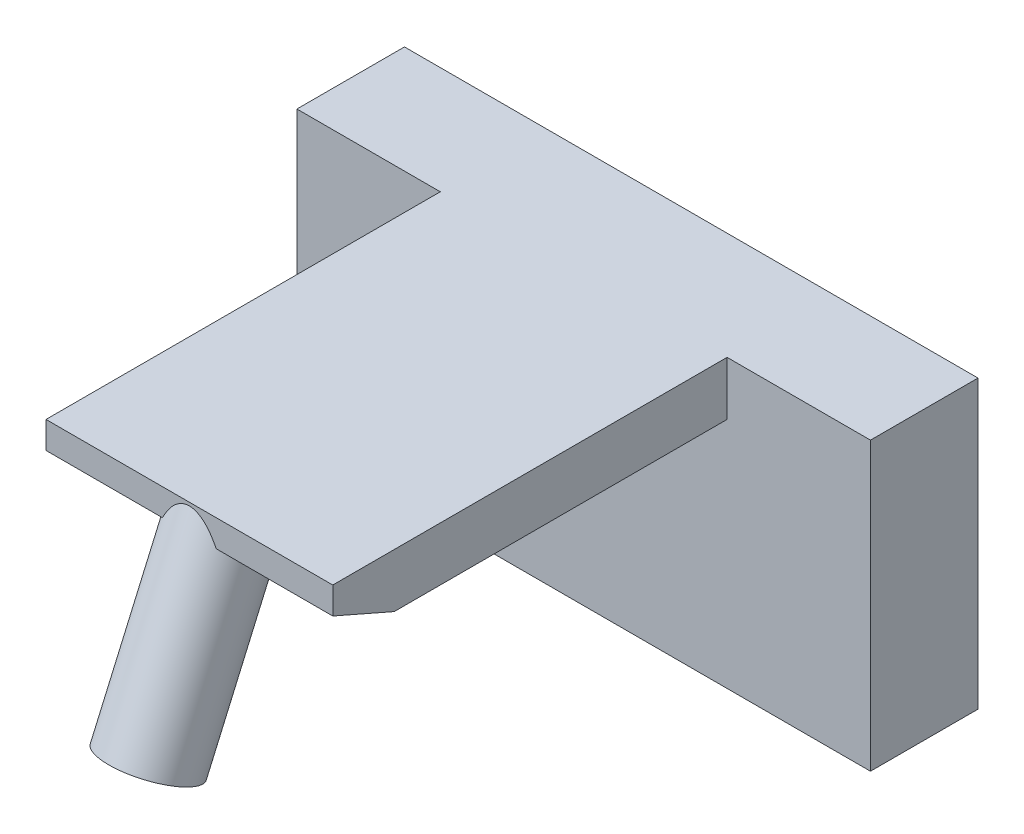
ISO-10303-21;
HEADER;
FILE_DESCRIPTION(('STEP AP214'),'2;1');
FILE_NAME('part.step','',(''),(''),'','','');
FILE_SCHEMA(('AUTOMOTIVE_DESIGN { 1 0 10303 214 1 1 1 1 }'));
ENDSEC;
DATA;
#1=APPLICATION_CONTEXT('core data for automotive mechanical design processes');
#2=APPLICATION_PROTOCOL_DEFINITION('international standard','automotive_design',2000,#1);
#3=PRODUCT_CONTEXT('',#1,'mechanical');
#4=PRODUCT('Part','Part','',(#3));
#5=PRODUCT_RELATED_PRODUCT_CATEGORY('part','',(#4));
#6=PRODUCT_DEFINITION_FORMATION('','',#4);
#7=PRODUCT_DEFINITION_CONTEXT('part definition',#1,'design');
#8=PRODUCT_DEFINITION('design','',#6,#7);
#9=PRODUCT_DEFINITION_SHAPE('','',#8);
#10=(LENGTH_UNIT() NAMED_UNIT(*) SI_UNIT(.MILLI.,.METRE.));
#11=(NAMED_UNIT(*) PLANE_ANGLE_UNIT() SI_UNIT($,.RADIAN.));
#12=(NAMED_UNIT(*) SI_UNIT($,.STERADIAN.) SOLID_ANGLE_UNIT());
#13=UNCERTAINTY_MEASURE_WITH_UNIT(LENGTH_MEASURE(1.E-05),#10,'distance_accuracy_value','');
#14=(GEOMETRIC_REPRESENTATION_CONTEXT(3) GLOBAL_UNCERTAINTY_ASSIGNED_CONTEXT((#13)) GLOBAL_UNIT_ASSIGNED_CONTEXT((#10,
#11,#12)) REPRESENTATION_CONTEXT('',''));
#15=CARTESIAN_POINT('',(0.,0.,0.));
#16=DIRECTION('',(0.,0.,1.));
#17=DIRECTION('',(1.,0.,0.));
#18=AXIS2_PLACEMENT_3D('',#15,#16,#17);
#19=CARTESIAN_POINT('',(0.,0.,3.));
#20=DIRECTION('',(0.,0.,-1.));
#21=DIRECTION('',(-1.,0.,0.));
#22=AXIS2_PLACEMENT_3D('',#19,#20,#21);
#23=PLANE('',#22);
#24=DIRECTION('',(0.,-1.,0.));
#25=VECTOR('',#24,1.);
#26=CARTESIAN_POINT('',(-17.5695150583409,0.,3.));
#27=LINE('',#26,#25);
#28=CARTESIAN_POINT('',(-17.5695150583409,22.0447702701312,3.));
#29=VERTEX_POINT('',#28);
#30=CARTESIAN_POINT('',(-17.5695150583409,20.5447702701312,3.));
#31=VERTEX_POINT('',#30);
#32=EDGE_CURVE('E271',#29,#31,#27,.T.);
#33=ORIENTED_EDGE('',*,*,#32,.F.);
#34=DIRECTION('',(-1.,0.,0.));
#35=VECTOR('',#34,1.);
#36=CARTESIAN_POINT('',(-21.5695150583409,22.0447702701312,3.));
#37=LINE('',#36,#35);
#38=CARTESIAN_POINT('',(-21.5695150583409,22.0447702701312,3.));
#39=VERTEX_POINT('',#38);
#40=EDGE_CURVE('E327',#29,#39,#37,.T.);
#41=ORIENTED_EDGE('',*,*,#40,.T.);
#42=DIRECTION('',(0.,-1.,0.));
#43=VECTOR('',#42,1.);
#44=CARTESIAN_POINT('',(-21.5695150583409,14.0447702701312,3.));
#45=LINE('',#44,#43);
#46=CARTESIAN_POINT('',(-21.5695150583409,14.0447702701312,3.));
#47=VERTEX_POINT('',#46);
#48=EDGE_CURVE('E220',#39,#47,#45,.T.);
#49=ORIENTED_EDGE('',*,*,#48,.T.);
#50=DIRECTION('',(1.,0.,0.));
#51=VECTOR('',#50,1.);
#52=CARTESIAN_POINT('',(-21.5695150583409,14.0447702701312,3.));
#53=LINE('',#52,#51);
#54=CARTESIAN_POINT('',(-5.5695150583409,14.0447702701312,3.));
#55=VERTEX_POINT('',#54);
#56=EDGE_CURVE('E234',#47,#55,#53,.T.);
#57=ORIENTED_EDGE('',*,*,#56,.T.);
#58=DIRECTION('',(0.,1.,0.));
#59=VECTOR('',#58,1.);
#60=CARTESIAN_POINT('',(-5.5695150583409,14.0447702701312,3.));
#61=LINE('',#60,#59);
#62=CARTESIAN_POINT('',(-5.5695150583409,22.0447702701312,3.));
#63=VERTEX_POINT('',#62);
#64=EDGE_CURVE('E227',#55,#63,#61,.T.);
#65=ORIENTED_EDGE('',*,*,#64,.T.);
#66=CARTESIAN_POINT('',(-9.5695150583409,22.0447702701312,3.));
#67=VERTEX_POINT('',#66);
#68=EDGE_CURVE('E328',#63,#67,#37,.T.);
#69=ORIENTED_EDGE('',*,*,#68,.T.);
#70=DIRECTION('',(0.,-1.,0.));
#71=VECTOR('',#70,1.);
#72=CARTESIAN_POINT('',(-9.5695150583409,0.,3.));
#73=LINE('',#72,#71);
#74=CARTESIAN_POINT('',(-9.5695150583409,20.5447702701312,3.));
#75=VERTEX_POINT('',#74);
#76=EDGE_CURVE('E268',#67,#75,#73,.T.);
#77=ORIENTED_EDGE('',*,*,#76,.T.);
#78=DIRECTION('',(-1.,0.,0.));
#79=VECTOR('',#78,1.);
#80=CARTESIAN_POINT('',(0.,20.5447702701312,3.));
#81=LINE('',#80,#79);
#82=CARTESIAN_POINT('',(-11.5695150583409,20.5447702701312,3.));
#83=VERTEX_POINT('',#82);
#84=EDGE_CURVE('E265',#75,#83,#81,.T.);
#85=ORIENTED_EDGE('',*,*,#84,.T.);
#86=CARTESIAN_POINT('',(-13.5695150583409,22.0447702701312,3.));
#87=DIRECTION('',(0.,0.,1.));
#88=DIRECTION('',(1.,0.,0.));
#89=AXIS2_PLACEMENT_3D('',#86,#87,#88);
#90=CIRCLE('',#89,2.5);
#91=CARTESIAN_POINT('',(-15.5695150583409,20.5447702701312,3.));
#92=VERTEX_POINT('',#91);
#93=EDGE_CURVE('E262',#92,#83,#90,.T.);
#94=ORIENTED_EDGE('',*,*,#93,.F.);
#95=DIRECTION('',(1.,0.,0.));
#96=VECTOR('',#95,1.);
#97=CARTESIAN_POINT('',(0.,20.5447702701312,3.));
#98=LINE('',#97,#96);
#99=EDGE_CURVE('E273',#31,#92,#98,.T.);
#100=ORIENTED_EDGE('',*,*,#99,.F.);
#101=EDGE_LOOP('',(#33,#41,#49,#57,#65,#69,#77,#85,#94,#100));
#102=FACE_BOUND('',#101,.T.);
#103=ADVANCED_FACE('F37',(#102),#23,.F.);
#104=CARTESIAN_POINT('',(0.,0.,0.));
#105=DIRECTION('',(0.,0.,-1.));
#106=DIRECTION('',(-1.,0.,0.));
#107=AXIS2_PLACEMENT_3D('',#104,#105,#106);
#108=PLANE('',#107);
#109=DIRECTION('',(0.,1.,0.));
#110=VECTOR('',#109,1.);
#111=CARTESIAN_POINT('',(-5.5695150583409,14.0447702701312,0.));
#112=LINE('',#111,#110);
#113=CARTESIAN_POINT('',(-5.5695150583409,14.0447702701312,0.));
#114=VERTEX_POINT('',#113);
#115=CARTESIAN_POINT('',(-5.5695150583409,22.0447702701312,0.));
#116=VERTEX_POINT('',#115);
#117=EDGE_CURVE('E216',#114,#116,#112,.T.);
#118=ORIENTED_EDGE('',*,*,#117,.F.);
#119=DIRECTION('',(1.,0.,0.));
#120=VECTOR('',#119,1.);
#121=CARTESIAN_POINT('',(-21.5695150583409,14.0447702701312,0.));
#122=LINE('',#121,#120);
#123=CARTESIAN_POINT('',(-21.5695150583409,14.0447702701312,0.));
#124=VERTEX_POINT('',#123);
#125=EDGE_CURVE('E225',#124,#114,#122,.T.);
#126=ORIENTED_EDGE('',*,*,#125,.F.);
#127=DIRECTION('',(0.,-1.,0.));
#128=VECTOR('',#127,1.);
#129=CARTESIAN_POINT('',(-21.5695150583409,14.0447702701312,0.));
#130=LINE('',#129,#128);
#131=CARTESIAN_POINT('',(-21.5695150583409,22.0447702701312,0.));
#132=VERTEX_POINT('',#131);
#133=EDGE_CURVE('E215',#132,#124,#130,.T.);
#134=ORIENTED_EDGE('',*,*,#133,.F.);
#135=DIRECTION('',(-1.,0.,0.));
#136=VECTOR('',#135,1.);
#137=CARTESIAN_POINT('',(-21.5695150583409,22.0447702701312,0.));
#138=LINE('',#137,#136);
#139=EDGE_CURVE('E205',#116,#132,#138,.T.);
#140=ORIENTED_EDGE('',*,*,#139,.F.);
#141=EDGE_LOOP('',(#118,#126,#134,#140));
#142=FACE_BOUND('',#141,.T.);
#143=DIRECTION('',(1.,0.,0.));
#144=VECTOR('',#143,1.);
#145=CARTESIAN_POINT('',(0.,15.0447702701312,0.));
#146=LINE('',#145,#144);
#147=CARTESIAN_POINT('',(-20.5695150583409,15.0447702701312,0.));
#148=VERTEX_POINT('',#147);
#149=CARTESIAN_POINT('',(-6.5695150583409,15.0447702701312,0.));
#150=VERTEX_POINT('',#149);
#151=EDGE_CURVE('E303',#148,#150,#146,.T.);
#152=ORIENTED_EDGE('',*,*,#151,.T.);
#153=DIRECTION('',(0.,1.,0.));
#154=VECTOR('',#153,1.);
#155=CARTESIAN_POINT('',(-6.5695150583409,0.,0.));
#156=LINE('',#155,#154);
#157=CARTESIAN_POINT('',(-6.5695150583409,21.0447702701312,0.));
#158=VERTEX_POINT('',#157);
#159=EDGE_CURVE('E292',#150,#158,#156,.T.);
#160=ORIENTED_EDGE('',*,*,#159,.T.);
#161=DIRECTION('',(-1.,0.,0.));
#162=VECTOR('',#161,1.);
#163=CARTESIAN_POINT('',(0.,21.0447702701312,0.));
#164=LINE('',#163,#162);
#165=CARTESIAN_POINT('',(-20.5695150583409,21.0447702701312,0.));
#166=VERTEX_POINT('',#165);
#167=EDGE_CURVE('E317',#158,#166,#164,.T.);
#168=ORIENTED_EDGE('',*,*,#167,.T.);
#169=DIRECTION('',(0.,-1.,0.));
#170=VECTOR('',#169,1.);
#171=CARTESIAN_POINT('',(-20.5695150583409,0.,0.));
#172=LINE('',#171,#170);
#173=EDGE_CURVE('E320',#166,#148,#172,.T.);
#174=ORIENTED_EDGE('',*,*,#173,.T.);
#175=EDGE_LOOP('',(#152,#160,#168,#174));
#176=FACE_BOUND('',#175,.T.);
#177=ADVANCED_FACE('F172',(#142,#176),#108,.T.);
#178=CARTESIAN_POINT('',(-5.5695150583409,14.0447702701312,3.));
#179=DIRECTION('',(-1.,0.,0.));
#180=DIRECTION('',(0.,0.,1.));
#181=AXIS2_PLACEMENT_3D('',#178,#179,#180);
#182=PLANE('',#181);
#183=ORIENTED_EDGE('',*,*,#117,.T.);
#184=DIRECTION('',(0.,0.,-1.));
#185=VECTOR('',#184,1.);
#186=CARTESIAN_POINT('',(-5.5695150583409,22.0447702701312,3.));
#187=LINE('',#186,#185);
#188=EDGE_CURVE('E211',#63,#116,#187,.T.);
#189=ORIENTED_EDGE('',*,*,#188,.F.);
#190=ORIENTED_EDGE('',*,*,#64,.F.);
#191=DIRECTION('',(0.,0.,-1.));
#192=VECTOR('',#191,1.);
#193=CARTESIAN_POINT('',(-5.5695150583409,14.0447702701312,3.));
#194=LINE('',#193,#192);
#195=EDGE_CURVE('E231',#55,#114,#194,.T.);
#196=ORIENTED_EDGE('',*,*,#195,.T.);
#197=EDGE_LOOP('',(#183,#189,#190,#196));
#198=FACE_BOUND('',#197,.T.);
#199=ADVANCED_FACE('F39',(#198),#182,.F.);
#200=CARTESIAN_POINT('',(-21.5695150583409,22.0447702701312,3.));
#201=DIRECTION('',(0.,-1.,0.));
#202=DIRECTION('',(0.,0.,-1.));
#203=AXIS2_PLACEMENT_3D('',#200,#201,#202);
#204=PLANE('',#203);
#205=ORIENTED_EDGE('',*,*,#139,.T.);
#206=DIRECTION('',(0.,0.,-1.));
#207=VECTOR('',#206,1.);
#208=CARTESIAN_POINT('',(-21.5695150583409,22.0447702701312,3.));
#209=LINE('',#208,#207);
#210=EDGE_CURVE('E208',#39,#132,#209,.T.);
#211=ORIENTED_EDGE('',*,*,#210,.F.);
#212=ORIENTED_EDGE('',*,*,#40,.F.);
#213=DIRECTION('',(0.,0.,-1.));
#214=VECTOR('',#213,1.);
#215=CARTESIAN_POINT('',(-17.5695150583409,22.0447702701312,14.));
#216=LINE('',#215,#214);
#217=CARTESIAN_POINT('',(-17.5695150583409,22.0447702701312,14.));
#218=VERTEX_POINT('',#217);
#219=EDGE_CURVE('E277',#218,#29,#216,.T.);
#220=ORIENTED_EDGE('',*,*,#219,.F.);
#221=DIRECTION('',(-1.,0.,0.));
#222=VECTOR('',#221,1.);
#223=CARTESIAN_POINT('',(0.,22.0447702701312,14.));
#224=LINE('',#223,#222);
#225=CARTESIAN_POINT('',(-9.5695150583409,22.0447702701312,14.));
#226=VERTEX_POINT('',#225);
#227=EDGE_CURVE('E253',#226,#218,#224,.T.);
#228=ORIENTED_EDGE('',*,*,#227,.F.);
#229=DIRECTION('',(0.,0.,-1.));
#230=VECTOR('',#229,1.);
#231=CARTESIAN_POINT('',(-9.5695150583409,22.0447702701312,14.));
#232=LINE('',#231,#230);
#233=EDGE_CURVE('E279',#226,#67,#232,.T.);
#234=ORIENTED_EDGE('',*,*,#233,.T.);
#235=ORIENTED_EDGE('',*,*,#68,.F.);
#236=ORIENTED_EDGE('',*,*,#188,.T.);
#237=EDGE_LOOP('',(#205,#211,#212,#220,#228,#234,#235,#236));
#238=FACE_BOUND('',#237,.T.);
#239=ADVANCED_FACE('F194',(#238),#204,.F.);
#240=CARTESIAN_POINT('',(-21.5695150583409,14.0447702701312,3.));
#241=DIRECTION('',(1.,0.,0.));
#242=DIRECTION('',(0.,0.,-1.));
#243=AXIS2_PLACEMENT_3D('',#240,#241,#242);
#244=PLANE('',#243);
#245=ORIENTED_EDGE('',*,*,#133,.T.);
#246=DIRECTION('',(0.,0.,-1.));
#247=VECTOR('',#246,1.);
#248=CARTESIAN_POINT('',(-21.5695150583409,14.0447702701312,3.));
#249=LINE('',#248,#247);
#250=EDGE_CURVE('E221',#47,#124,#249,.T.);
#251=ORIENTED_EDGE('',*,*,#250,.F.);
#252=ORIENTED_EDGE('',*,*,#48,.F.);
#253=ORIENTED_EDGE('',*,*,#210,.T.);
#254=EDGE_LOOP('',(#245,#251,#252,#253));
#255=FACE_BOUND('',#254,.T.);
#256=ADVANCED_FACE('F191',(#255),#244,.F.);
#257=CARTESIAN_POINT('',(-21.5695150583409,14.0447702701312,3.));
#258=DIRECTION('',(0.,1.,0.));
#259=DIRECTION('',(0.,0.,1.));
#260=AXIS2_PLACEMENT_3D('',#257,#258,#259);
#261=PLANE('',#260);
#262=ORIENTED_EDGE('',*,*,#125,.T.);
#263=ORIENTED_EDGE('',*,*,#195,.F.);
#264=ORIENTED_EDGE('',*,*,#56,.F.);
#265=ORIENTED_EDGE('',*,*,#250,.T.);
#266=EDGE_LOOP('',(#262,#263,#264,#265));
#267=FACE_BOUND('',#266,.T.);
#268=ADVANCED_FACE('F187',(#267),#261,.F.);
#269=CARTESIAN_POINT('',(-6.5695150583409,14.0447702701312,3.));
#270=DIRECTION('',(-1.,0.,0.));
#271=DIRECTION('',(0.,0.,1.));
#272=AXIS2_PLACEMENT_3D('',#269,#270,#271);
#273=PLANE('',#272);
#274=ORIENTED_EDGE('',*,*,#159,.F.);
#275=DIRECTION('',(0.,0.,-1.));
#276=VECTOR('',#275,1.);
#277=CARTESIAN_POINT('',(-6.5695150583409,15.0447702701312,3.));
#278=LINE('',#277,#276);
#279=CARTESIAN_POINT('',(-6.5695150583409,15.0447702701312,2.));
#280=VERTEX_POINT('',#279);
#281=EDGE_CURVE('E304',#280,#150,#278,.T.);
#282=ORIENTED_EDGE('',*,*,#281,.F.);
#283=DIRECTION('',(0.,1.,0.));
#284=VECTOR('',#283,1.);
#285=CARTESIAN_POINT('',(-6.5695150583409,0.,2.));
#286=LINE('',#285,#284);
#287=CARTESIAN_POINT('',(-6.5695150583409,21.0447702701312,2.));
#288=VERTEX_POINT('',#287);
#289=EDGE_CURVE('E299',#280,#288,#286,.T.);
#290=ORIENTED_EDGE('',*,*,#289,.T.);
#291=DIRECTION('',(0.,0.,-1.));
#292=VECTOR('',#291,1.);
#293=CARTESIAN_POINT('',(-6.5695150583409,21.0447702701312,3.));
#294=LINE('',#293,#292);
#295=EDGE_CURVE('E295',#288,#158,#294,.T.);
#296=ORIENTED_EDGE('',*,*,#295,.T.);
#297=EDGE_LOOP('',(#274,#282,#290,#296));
#298=FACE_BOUND('',#297,.T.);
#299=ADVANCED_FACE('F190',(#298),#273,.T.);
#300=CARTESIAN_POINT('',(-21.5695150583409,21.0447702701312,3.));
#301=DIRECTION('',(0.,-1.,0.));
#302=DIRECTION('',(0.,0.,-1.));
#303=AXIS2_PLACEMENT_3D('',#300,#301,#302);
#304=PLANE('',#303);
#305=ORIENTED_EDGE('',*,*,#167,.F.);
#306=ORIENTED_EDGE('',*,*,#295,.F.);
#307=DIRECTION('',(-1.,0.,0.));
#308=VECTOR('',#307,1.);
#309=CARTESIAN_POINT('',(0.,21.0447702701312,2.));
#310=LINE('',#309,#308);
#311=CARTESIAN_POINT('',(-20.5695150583409,21.0447702701312,2.));
#312=VERTEX_POINT('',#311);
#313=EDGE_CURVE('E302',#288,#312,#310,.T.);
#314=ORIENTED_EDGE('',*,*,#313,.T.);
#315=DIRECTION('',(0.,0.,-1.));
#316=VECTOR('',#315,1.);
#317=CARTESIAN_POINT('',(-20.5695150583409,21.0447702701312,3.));
#318=LINE('',#317,#316);
#319=EDGE_CURVE('E298',#312,#166,#318,.T.);
#320=ORIENTED_EDGE('',*,*,#319,.T.);
#321=EDGE_LOOP('',(#305,#306,#314,#320));
#322=FACE_BOUND('',#321,.T.);
#323=ADVANCED_FACE('F380',(#322),#304,.T.);
#324=CARTESIAN_POINT('',(-20.5695150583409,14.0447702701312,3.));
#325=DIRECTION('',(1.,0.,0.));
#326=DIRECTION('',(0.,0.,-1.));
#327=AXIS2_PLACEMENT_3D('',#324,#325,#326);
#328=PLANE('',#327);
#329=ORIENTED_EDGE('',*,*,#173,.F.);
#330=ORIENTED_EDGE('',*,*,#319,.F.);
#331=DIRECTION('',(0.,-1.,0.));
#332=VECTOR('',#331,1.);
#333=CARTESIAN_POINT('',(-20.5695150583409,0.,2.));
#334=LINE('',#333,#332);
#335=CARTESIAN_POINT('',(-20.5695150583409,15.0447702701312,2.));
#336=VERTEX_POINT('',#335);
#337=EDGE_CURVE('E311',#312,#336,#334,.T.);
#338=ORIENTED_EDGE('',*,*,#337,.T.);
#339=DIRECTION('',(0.,0.,-1.));
#340=VECTOR('',#339,1.);
#341=CARTESIAN_POINT('',(-20.5695150583409,15.0447702701312,3.));
#342=LINE('',#341,#340);
#343=EDGE_CURVE('E306',#336,#148,#342,.T.);
#344=ORIENTED_EDGE('',*,*,#343,.T.);
#345=EDGE_LOOP('',(#329,#330,#338,#344));
#346=FACE_BOUND('',#345,.T.);
#347=ADVANCED_FACE('F384',(#346),#328,.T.);
#348=CARTESIAN_POINT('',(-21.5695150583409,15.0447702701312,3.));
#349=DIRECTION('',(0.,1.,0.));
#350=DIRECTION('',(0.,0.,1.));
#351=AXIS2_PLACEMENT_3D('',#348,#349,#350);
#352=PLANE('',#351);
#353=ORIENTED_EDGE('',*,*,#151,.F.);
#354=ORIENTED_EDGE('',*,*,#343,.F.);
#355=DIRECTION('',(1.,0.,0.));
#356=VECTOR('',#355,1.);
#357=CARTESIAN_POINT('',(0.,15.0447702701312,2.));
#358=LINE('',#357,#356);
#359=EDGE_CURVE('E307',#336,#280,#358,.T.);
#360=ORIENTED_EDGE('',*,*,#359,.T.);
#361=ORIENTED_EDGE('',*,*,#281,.T.);
#362=EDGE_LOOP('',(#353,#354,#360,#361));
#363=FACE_BOUND('',#362,.T.);
#364=ADVANCED_FACE('F387',(#363),#352,.T.);
#365=CARTESIAN_POINT('',(0.,0.,2.));
#366=DIRECTION('',(0.,0.,-1.));
#367=DIRECTION('',(-1.,0.,0.));
#368=AXIS2_PLACEMENT_3D('',#365,#366,#367);
#369=PLANE('',#368);
#370=CARTESIAN_POINT('',(-13.5695150583409,18.0447702701312,2.));
#371=DIRECTION('',(0.,0.,-1.));
#372=DIRECTION('',(-1.,0.,0.));
#373=AXIS2_PLACEMENT_3D('',#370,#371,#372);
#374=CIRCLE('',#373,1.5);
#375=CARTESIAN_POINT('',(-15.0695150583409,18.0447702701312,2.));
#376=VERTEX_POINT('',#375);
#377=EDGE_CURVE('E288',#376,#376,#374,.T.);
#378=ORIENTED_EDGE('',*,*,#377,.F.);
#379=EDGE_LOOP('',(#378));
#380=FACE_BOUND('',#379,.T.);
#381=ORIENTED_EDGE('',*,*,#289,.F.);
#382=ORIENTED_EDGE('',*,*,#359,.F.);
#383=ORIENTED_EDGE('',*,*,#337,.F.);
#384=ORIENTED_EDGE('',*,*,#313,.F.);
#385=EDGE_LOOP('',(#381,#382,#383,#384));
#386=FACE_BOUND('',#385,.T.);
#387=ADVANCED_FACE('F184',(#380,#386),#369,.T.);
#388=CARTESIAN_POINT('',(-13.5695150583409,18.0447702701312,0.));
#389=DIRECTION('',(0.,0.,-1.));
#390=DIRECTION('',(-1.,0.,0.));
#391=AXIS2_PLACEMENT_3D('',#388,#389,#390);
#392=PLANE('',#391);
#393=CARTESIAN_POINT('',(-13.5695150583409,18.0447702701312,0.));
#394=DIRECTION('',(0.,0.,-1.));
#395=DIRECTION('',(-1.,0.,0.));
#396=AXIS2_PLACEMENT_3D('',#393,#394,#395);
#397=CIRCLE('',#396,1.5);
#398=CARTESIAN_POINT('',(-15.0695150583409,18.0447702701312,0.));
#399=VERTEX_POINT('',#398);
#400=EDGE_CURVE('E289',#399,#399,#397,.T.);
#401=ORIENTED_EDGE('',*,*,#400,.T.);
#402=EDGE_LOOP('',(#401));
#403=FACE_BOUND('',#402,.T.);
#404=CARTESIAN_POINT('',(-13.5695150583409,18.0447702701312,0.));
#405=DIRECTION('',(0.,0.,-1.));
#406=DIRECTION('',(-1.,0.,0.));
#407=AXIS2_PLACEMENT_3D('',#404,#405,#406);
#408=CIRCLE('',#407,0.8);
#409=CARTESIAN_POINT('',(-14.3695150583409,18.0447702701312,0.));
#410=VERTEX_POINT('',#409);
#411=EDGE_CURVE('E285',#410,#410,#408,.T.);
#412=ORIENTED_EDGE('',*,*,#411,.F.);
#413=EDGE_LOOP('',(#412));
#414=FACE_BOUND('',#413,.T.);
#415=ADVANCED_FACE('F371',(#403,#414),#392,.T.);
#416=CARTESIAN_POINT('',(-13.5695150583409,18.0447702701312,0.));
#417=DIRECTION('',(0.,0.,1.));
#418=DIRECTION('',(1.,0.,0.));
#419=AXIS2_PLACEMENT_3D('',#416,#417,#418);
#420=CYLINDRICAL_SURFACE('',#419,1.5);
#421=ORIENTED_EDGE('',*,*,#400,.F.);
#422=EDGE_LOOP('',(#421));
#423=FACE_BOUND('',#422,.T.);
#424=ORIENTED_EDGE('',*,*,#377,.T.);
#425=EDGE_LOOP('',(#424));
#426=FACE_BOUND('',#425,.T.);
#427=ADVANCED_FACE('F369',(#423,#426),#420,.T.);
#428=CARTESIAN_POINT('',(-13.5695150583409,18.0447702701312,0.));
#429=DIRECTION('',(0.,0.,1.));
#430=DIRECTION('',(1.,0.,0.));
#431=AXIS2_PLACEMENT_3D('',#428,#429,#430);
#432=CYLINDRICAL_SURFACE('',#431,0.8);
#433=ORIENTED_EDGE('',*,*,#411,.T.);
#434=EDGE_LOOP('',(#433));
#435=FACE_BOUND('',#434,.T.);
#436=CARTESIAN_POINT('',(-13.5695150583409,18.0447702701312,2.));
#437=DIRECTION('',(0.,0.,-1.));
#438=DIRECTION('',(-1.,0.,0.));
#439=AXIS2_PLACEMENT_3D('',#436,#437,#438);
#440=CIRCLE('',#439,0.8);
#441=CARTESIAN_POINT('',(-14.3695150583409,18.0447702701312,2.));
#442=VERTEX_POINT('',#441);
#443=EDGE_CURVE('E236',#442,#442,#440,.F.);
#444=ORIENTED_EDGE('',*,*,#443,.T.);
#445=EDGE_LOOP('',(#444));
#446=FACE_BOUND('',#445,.T.);
#447=ADVANCED_FACE('F363',(#435,#446),#432,.F.);
#448=ORIENTED_EDGE('',*,*,#443,.F.);
#449=EDGE_LOOP('',(#448));
#450=FACE_BOUND('',#449,.T.);
#451=ADVANCED_FACE('F356',(#450),#369,.T.);
#452=CARTESIAN_POINT('',(-13.5695150583409,22.0447702701312,14.));
#453=DIRECTION('',(0.,0.,-1.));
#454=DIRECTION('',(-1.,0.,0.));
#455=AXIS2_PLACEMENT_3D('',#452,#453,#454);
#456=CYLINDRICAL_SURFACE('',#455,2.5);
#457=CARTESIAN_POINT('',(-13.5695150583409,22.0447702701312,15.7142857142857));
#458=DIRECTION('',(0.,0.916157334902189,-0.400818834019707));
#459=DIRECTION('',(0.,-0.400818834019707,-0.916157334902189));
#460=AXIS2_PLACEMENT_3D('',#457,#458,#459);
#461=ELLIPSE('',#460,6.23723185591893,2.5);
#462=CARTESIAN_POINT('',(-11.5695150583409,20.5447702701312,12.2857142857143));
#463=VERTEX_POINT('',#462);
#464=CARTESIAN_POINT('',(-15.5695150583409,20.5447702701312,12.2857142857143));
#465=VERTEX_POINT('',#464);
#466=EDGE_CURVE('E339',#463,#465,#461,.T.);
#467=ORIENTED_EDGE('',*,*,#466,.T.);
#468=DIRECTION('',(0.,0.,-1.));
#469=VECTOR('',#468,1.);
#470=CARTESIAN_POINT('',(-15.5695150583409,20.5447702701312,14.));
#471=LINE('',#470,#469);
#472=EDGE_CURVE('E255',#465,#92,#471,.T.);
#473=ORIENTED_EDGE('',*,*,#472,.T.);
#474=ORIENTED_EDGE('',*,*,#93,.T.);
#475=DIRECTION('',(0.,0.,-1.));
#476=VECTOR('',#475,1.);
#477=CARTESIAN_POINT('',(-11.5695150583409,20.5447702701312,14.));
#478=LINE('',#477,#476);
#479=EDGE_CURVE('E283',#463,#83,#478,.T.);
#480=ORIENTED_EDGE('',*,*,#479,.F.);
#481=EDGE_LOOP('',(#467,#473,#474,#480));
#482=FACE_BOUND('',#481,.T.);
#483=ADVANCED_FACE('F355',(#482),#456,.T.);
#484=CARTESIAN_POINT('',(0.,20.5447702701312,14.));
#485=DIRECTION('',(0.,-1.,0.));
#486=DIRECTION('',(0.,0.,-1.));
#487=AXIS2_PLACEMENT_3D('',#484,#485,#486);
#488=PLANE('',#487);
#489=DIRECTION('',(1.,0.,0.));
#490=VECTOR('',#489,1.);
#491=CARTESIAN_POINT('',(0.,20.5447702701312,12.2857142857143));
#492=LINE('',#491,#490);
#493=CARTESIAN_POINT('',(-9.5695150583409,20.5447702701312,12.2857142857143));
#494=VERTEX_POINT('',#493);
#495=EDGE_CURVE('E341',#463,#494,#492,.T.);
#496=ORIENTED_EDGE('',*,*,#495,.F.);
#497=ORIENTED_EDGE('',*,*,#479,.T.);
#498=ORIENTED_EDGE('',*,*,#84,.F.);
#499=DIRECTION('',(0.,0.,-1.));
#500=VECTOR('',#499,1.);
#501=CARTESIAN_POINT('',(-9.5695150583409,20.5447702701312,14.));
#502=LINE('',#501,#500);
#503=EDGE_CURVE('E281',#494,#75,#502,.T.);
#504=ORIENTED_EDGE('',*,*,#503,.F.);
#505=EDGE_LOOP('',(#496,#497,#498,#504));
#506=FACE_BOUND('',#505,.T.);
#507=ADVANCED_FACE('F352',(#506),#488,.T.);
#508=CARTESIAN_POINT('',(-9.5695150583409,0.,14.));
#509=DIRECTION('',(1.,0.,0.));
#510=DIRECTION('',(0.,0.,-1.));
#511=AXIS2_PLACEMENT_3D('',#508,#509,#510);
#512=PLANE('',#511);
#513=DIRECTION('',(0.,0.400818834019707,0.916157334902189));
#514=VECTOR('',#513,1.);
#515=CARTESIAN_POINT('',(-9.5695150583409,17.8736432431265,6.18028108113217));
#516=LINE('',#515,#514);
#517=CARTESIAN_POINT('',(-9.5695150583409,21.2947702701312,14.));
#518=VERTEX_POINT('',#517);
#519=EDGE_CURVE('E58',#494,#518,#516,.T.);
#520=ORIENTED_EDGE('',*,*,#519,.F.);
#521=ORIENTED_EDGE('',*,*,#503,.T.);
#522=ORIENTED_EDGE('',*,*,#76,.F.);
#523=ORIENTED_EDGE('',*,*,#233,.F.);
#524=DIRECTION('',(0.,-1.,0.));
#525=VECTOR('',#524,1.);
#526=CARTESIAN_POINT('',(-9.5695150583409,0.,14.));
#527=LINE('',#526,#525);
#528=EDGE_CURVE('E258',#226,#518,#527,.T.);
#529=ORIENTED_EDGE('',*,*,#528,.T.);
#530=EDGE_LOOP('',(#520,#521,#522,#523,#529));
#531=FACE_BOUND('',#530,.T.);
#532=ADVANCED_FACE('F346',(#531),#512,.T.);
#533=CARTESIAN_POINT('',(-17.5695150583409,0.,14.));
#534=DIRECTION('',(1.,0.,0.));
#535=DIRECTION('',(0.,0.,-1.));
#536=AXIS2_PLACEMENT_3D('',#533,#534,#535);
#537=PLANE('',#536);
#538=DIRECTION('',(0.,0.,-1.));
#539=VECTOR('',#538,1.);
#540=CARTESIAN_POINT('',(-17.5695150583409,20.5447702701312,14.));
#541=LINE('',#540,#539);
#542=CARTESIAN_POINT('',(-17.5695150583409,20.5447702701312,12.2857142857143));
#543=VERTEX_POINT('',#542);
#544=EDGE_CURVE('E249',#543,#31,#541,.T.);
#545=ORIENTED_EDGE('',*,*,#544,.F.);
#546=DIRECTION('',(0.,-0.400818834019707,-0.916157334902189));
#547=VECTOR('',#546,1.);
#548=CARTESIAN_POINT('',(-17.5695150583409,21.2947702701312,14.));
#549=LINE('',#548,#547);
#550=CARTESIAN_POINT('',(-17.5695150583409,21.2947702701312,14.));
#551=VERTEX_POINT('',#550);
#552=EDGE_CURVE('E158',#551,#543,#549,.T.);
#553=ORIENTED_EDGE('',*,*,#552,.F.);
#554=DIRECTION('',(0.,-1.,0.));
#555=VECTOR('',#554,1.);
#556=CARTESIAN_POINT('',(-17.5695150583409,0.,14.));
#557=LINE('',#556,#555);
#558=EDGE_CURVE('E247',#218,#551,#557,.T.);
#559=ORIENTED_EDGE('',*,*,#558,.F.);
#560=ORIENTED_EDGE('',*,*,#219,.T.);
#561=ORIENTED_EDGE('',*,*,#32,.T.);
#562=EDGE_LOOP('',(#545,#553,#559,#560,#561));
#563=FACE_BOUND('',#562,.T.);
#564=ADVANCED_FACE('F246',(#563),#537,.F.);
#565=CARTESIAN_POINT('',(0.,20.5447702701312,14.));
#566=DIRECTION('',(0.,1.,0.));
#567=DIRECTION('',(0.,0.,1.));
#568=AXIS2_PLACEMENT_3D('',#565,#566,#567);
#569=PLANE('',#568);
#570=ORIENTED_EDGE('',*,*,#472,.F.);
#571=DIRECTION('',(-1.,0.,0.));
#572=VECTOR('',#571,1.);
#573=CARTESIAN_POINT('',(0.,20.5447702701312,12.2857142857143));
#574=LINE('',#573,#572);
#575=EDGE_CURVE('E250',#465,#543,#574,.T.);
#576=ORIENTED_EDGE('',*,*,#575,.T.);
#577=ORIENTED_EDGE('',*,*,#544,.T.);
#578=ORIENTED_EDGE('',*,*,#99,.T.);
#579=EDGE_LOOP('',(#570,#576,#577,#578));
#580=FACE_BOUND('',#579,.T.);
#581=ADVANCED_FACE('F169',(#580),#569,.F.);
#582=CARTESIAN_POINT('',(0.,0.,14.));
#583=DIRECTION('',(0.,0.,1.));
#584=DIRECTION('',(1.,0.,0.));
#585=AXIS2_PLACEMENT_3D('',#582,#583,#584);
#586=PLANE('',#585);
#587=CARTESIAN_POINT('',(-13.5695150583409,18.9605865966769,14.00000000001));
#588=DIRECTION('',(0.,0.,1.));
#589=DIRECTION('',(0.,-1.,0.));
#590=AXIS2_PLACEMENT_3D('',#587,#588,#589);
#591=ELLIPSE('',#590,2.99387129084109,1.2);
#592=CARTESIAN_POINT('',(-14.3209677331539,21.2947702701471,13.999999999993));
#593=VERTEX_POINT('',#592);
#594=CARTESIAN_POINT('',(-12.8180623835509,21.2947702701312,14.));
#595=VERTEX_POINT('',#594);
#596=EDGE_CURVE('E51',#593,#595,#591,.F.);
#597=ORIENTED_EDGE('',*,*,#596,.T.);
#598=DIRECTION('',(-1.,0.,0.));
#599=VECTOR('',#598,1.);
#600=CARTESIAN_POINT('',(0.,21.2947702701312,14.));
#601=LINE('',#600,#599);
#602=EDGE_CURVE('E11',#518,#595,#601,.T.);
#603=ORIENTED_EDGE('',*,*,#602,.F.);
#604=ORIENTED_EDGE('',*,*,#528,.F.);
#605=ORIENTED_EDGE('',*,*,#227,.T.);
#606=ORIENTED_EDGE('',*,*,#558,.T.);
#607=EDGE_CURVE('E45',#593,#551,#601,.T.);
#608=ORIENTED_EDGE('',*,*,#607,.F.);
#609=EDGE_LOOP('',(#597,#603,#604,#605,#606,#608));
#610=FACE_BOUND('',#609,.T.);
#611=ADVANCED_FACE('F154',(#610),#586,.T.);
#612=CARTESIAN_POINT('',(-7.5695150583409,21.2947702701312,14.));
#613=DIRECTION('',(0.,0.916157334902189,-0.400818834019707));
#614=DIRECTION('',(0.,0.400818834019707,0.916157334902189));
#615=AXIS2_PLACEMENT_3D('',#612,#613,#614);
#616=PLANE('',#615);
#617=ORIENTED_EDGE('',*,*,#602,.T.);
#618=CARTESIAN_POINT('',(-13.5695150583409,20.9197702701312,13.1428571428571));
#619=DIRECTION('',(0.,-0.916157334902189,0.400818834019707));
#620=DIRECTION('',(0.,-0.400818834019707,-0.916157334902189));
#621=AXIS2_PLACEMENT_3D('',#618,#619,#620);
#622=CIRCLE('',#621,1.2);
#623=EDGE_CURVE('E147',#593,#595,#622,.T.);
#624=ORIENTED_EDGE('',*,*,#623,.F.);
#625=ORIENTED_EDGE('',*,*,#607,.T.);
#626=ORIENTED_EDGE('',*,*,#552,.T.);
#627=ORIENTED_EDGE('',*,*,#575,.F.);
#628=ORIENTED_EDGE('',*,*,#466,.F.);
#629=ORIENTED_EDGE('',*,*,#495,.T.);
#630=ORIENTED_EDGE('',*,*,#519,.T.);
#631=EDGE_LOOP('',(#617,#624,#625,#626,#627,#628,#629,#630));
#632=FACE_BOUND('',#631,.T.);
#633=ADVANCED_FACE('F160',(#632),#616,.F.);
#634=CARTESIAN_POINT('',(-13.5695150583409,500000.480982601,-218727.915173252));
#635=DIRECTION('',(0.,-0.916157334902189,0.400818834019707));
#636=DIRECTION('',(0.,-0.400818834019707,-0.916157334902189));
#637=AXIS2_PLACEMENT_3D('',#634,#635,#636);
#638=CYLINDRICAL_SURFACE('',#637,1.2);
#639=ORIENTED_EDGE('',*,*,#596,.F.);
#640=ORIENTED_EDGE('',*,*,#623,.T.);
#641=EDGE_LOOP('',(#639,#640));
#642=FACE_BOUND('',#641,.T.);
#643=CARTESIAN_POINT('',(-13.5695150583409,16.3389835956202,15.1469513129557));
#644=DIRECTION('',(0.,-0.916157334902189,0.400818834019707));
#645=DIRECTION('',(0.,-0.400818834019707,-0.916157334902189));
#646=AXIS2_PLACEMENT_3D('',#643,#644,#645);
#647=CIRCLE('',#646,1.2);
#648=CARTESIAN_POINT('',(-13.5695150583409,15.8580009947966,14.0475625110731));
#649=VERTEX_POINT('',#648);
#650=EDGE_CURVE('E151',#649,#649,#647,.T.);
#651=ORIENTED_EDGE('',*,*,#650,.F.);
#652=EDGE_LOOP('',(#651));
#653=FACE_BOUND('',#652,.T.);
#654=ADVANCED_FACE('F148',(#642,#653),#638,.T.);
#655=CARTESIAN_POINT('',(-13.5695150583409,16.3389835956202,15.1469513129557));
#656=DIRECTION('',(0.,-0.916157334902189,0.400818834019707));
#657=DIRECTION('',(0.,-0.400818834019707,-0.916157334902189));
#658=AXIS2_PLACEMENT_3D('',#655,#656,#657);
#659=PLANE('',#658);
#660=ORIENTED_EDGE('',*,*,#650,.T.);
#661=EDGE_LOOP('',(#660));
#662=FACE_BOUND('',#661,.T.);
#663=ADVANCED_FACE('F167',(#662),#659,.T.);
#664=CLOSED_SHELL('',(#103,#177,#199,#239,#256,#268,#299,#323,#347,#364,#387,#415,#427,#447,
#451,#483,#507,#532,#564,#581,#611,#633,#654,#663));
#665=MANIFOLD_SOLID_BREP('B2',#664);
#666=ADVANCED_BREP_SHAPE_REPRESENTATION('',(#18,#665),#14);
#667=SHAPE_DEFINITION_REPRESENTATION(#9,#666);
ENDSEC;
END-ISO-10303-21;
